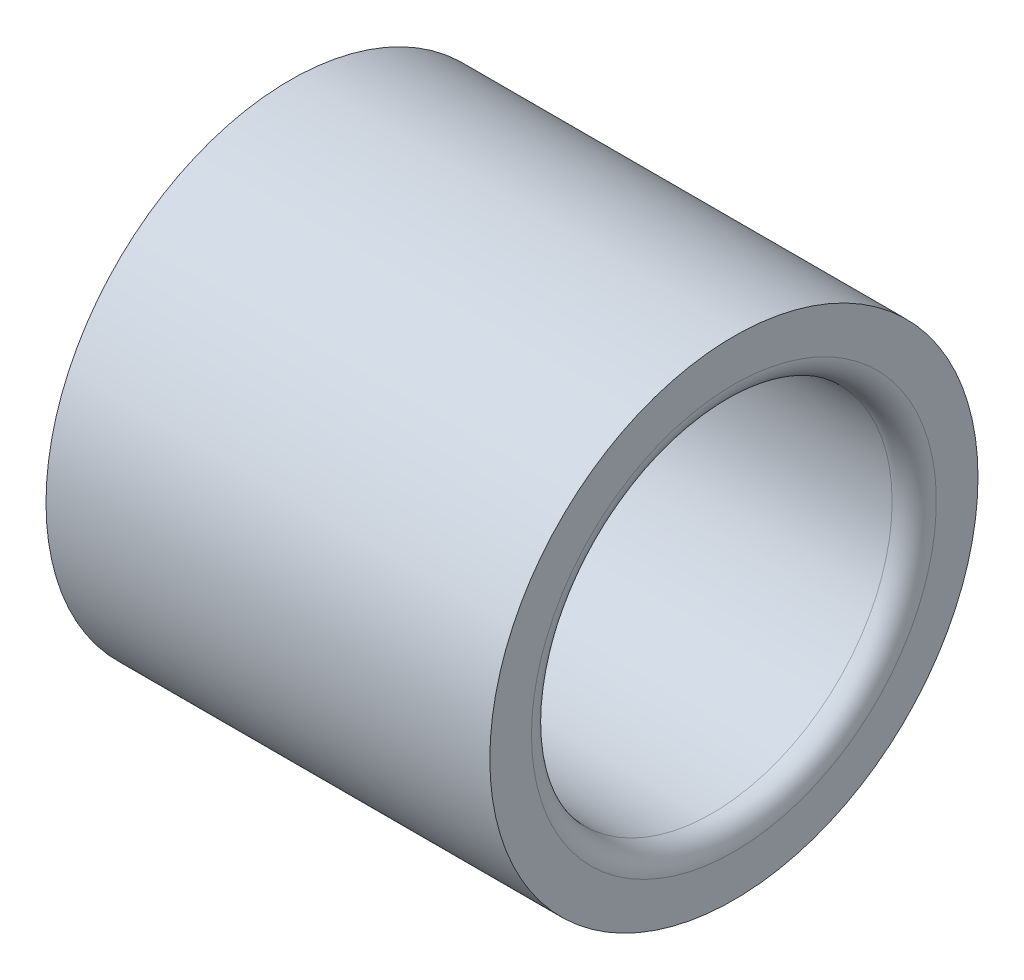
ISO-10303-21;
HEADER;
FILE_DESCRIPTION(('STEP AP214'),'2;1');
FILE_NAME('part.step','',(''),(''),'','','');
FILE_SCHEMA(('AUTOMOTIVE_DESIGN { 1 0 10303 214 1 1 1 1 }'));
ENDSEC;
DATA;
#1=APPLICATION_CONTEXT('core data for automotive mechanical design processes');
#2=APPLICATION_PROTOCOL_DEFINITION('international standard','automotive_design',2000,#1);
#3=PRODUCT_CONTEXT('',#1,'mechanical');
#4=PRODUCT('Part','Part','',(#3));
#5=PRODUCT_RELATED_PRODUCT_CATEGORY('part','',(#4));
#6=PRODUCT_DEFINITION_FORMATION('','',#4);
#7=PRODUCT_DEFINITION_CONTEXT('part definition',#1,'design');
#8=PRODUCT_DEFINITION('design','',#6,#7);
#9=PRODUCT_DEFINITION_SHAPE('','',#8);
#10=(LENGTH_UNIT() NAMED_UNIT(*) SI_UNIT(.MILLI.,.METRE.));
#11=(NAMED_UNIT(*) PLANE_ANGLE_UNIT() SI_UNIT($,.RADIAN.));
#12=(NAMED_UNIT(*) SI_UNIT($,.STERADIAN.) SOLID_ANGLE_UNIT());
#13=UNCERTAINTY_MEASURE_WITH_UNIT(LENGTH_MEASURE(1.E-05),#10,'distance_accuracy_value','');
#14=(GEOMETRIC_REPRESENTATION_CONTEXT(3) GLOBAL_UNCERTAINTY_ASSIGNED_CONTEXT((#13)) GLOBAL_UNIT_ASSIGNED_CONTEXT((#10,
#11,#12)) REPRESENTATION_CONTEXT('',''));
#15=CARTESIAN_POINT('',(0.,0.,0.));
#16=DIRECTION('',(0.,0.,1.));
#17=DIRECTION('',(1.,0.,0.));
#18=AXIS2_PLACEMENT_3D('',#15,#16,#17);
#19=CARTESIAN_POINT('',(0.,7.,0.));
#20=DIRECTION('',(1.,0.,0.));
#21=DIRECTION('',(0.,0.,-1.));
#22=AXIS2_PLACEMENT_3D('',#19,#20,#21);
#23=PLANE('',#22);
#24=CARTESIAN_POINT('',(0.,-4.,0.));
#25=DIRECTION('',(-1.,0.,0.));
#26=DIRECTION('',(0.,0.,1.));
#27=AXIS2_PLACEMENT_3D('',#24,#25,#26);
#28=CIRCLE('',#27,4.);
#29=CARTESIAN_POINT('',(0.,-4.,4.));
#30=VERTEX_POINT('',#29);
#31=EDGE_CURVE('E42',#30,#30,#28,.T.);
#32=ORIENTED_EDGE('',*,*,#31,.F.);
#33=EDGE_LOOP('',(#32));
#34=FACE_BOUND('',#33,.T.);
#35=CARTESIAN_POINT('',(0.,-4.,0.));
#36=DIRECTION('',(-1.,0.,0.));
#37=DIRECTION('',(0.,0.,1.));
#38=AXIS2_PLACEMENT_3D('',#35,#36,#37);
#39=CIRCLE('',#38,11.);
#40=CARTESIAN_POINT('',(0.,-4.,11.));
#41=VERTEX_POINT('',#40);
#42=EDGE_CURVE('E57',#41,#41,#39,.T.);
#43=ORIENTED_EDGE('',*,*,#42,.T.);
#44=EDGE_LOOP('',(#43));
#45=FACE_BOUND('',#44,.T.);
#46=ADVANCED_FACE('F31',(#34,#45),#23,.F.);
#47=CARTESIAN_POINT('',(-15.2207792207792,-4.,0.));
#48=DIRECTION('',(-1.,0.,0.));
#49=DIRECTION('',(0.,0.,1.));
#50=AXIS2_PLACEMENT_3D('',#47,#48,#49);
#51=CYLINDRICAL_SURFACE('',#50,4.);
#52=CARTESIAN_POINT('',(5.,-4.,0.));
#53=DIRECTION('',(-1.,0.,0.));
#54=DIRECTION('',(0.,0.,1.));
#55=AXIS2_PLACEMENT_3D('',#52,#53,#54);
#56=CIRCLE('',#55,4.);
#57=CARTESIAN_POINT('',(5.,-4.,4.));
#58=VERTEX_POINT('',#57);
#59=EDGE_CURVE('E46',#58,#58,#56,.T.);
#60=ORIENTED_EDGE('',*,*,#59,.F.);
#61=EDGE_LOOP('',(#60));
#62=FACE_BOUND('',#61,.T.);
#63=ORIENTED_EDGE('',*,*,#31,.T.);
#64=EDGE_LOOP('',(#63));
#65=FACE_BOUND('',#64,.T.);
#66=ADVANCED_FACE('F78',(#62,#65),#51,.F.);
#67=CARTESIAN_POINT('',(5.,0.,0.));
#68=DIRECTION('',(-1.,0.,0.));
#69=DIRECTION('',(0.,0.,1.));
#70=AXIS2_PLACEMENT_3D('',#67,#68,#69);
#71=PLANE('',#70);
#72=CARTESIAN_POINT('',(5.,-4.,0.));
#73=DIRECTION('',(-1.,0.,0.));
#74=DIRECTION('',(0.,0.,1.));
#75=AXIS2_PLACEMENT_3D('',#72,#73,#74);
#76=CIRCLE('',#75,8.);
#77=CARTESIAN_POINT('',(5.,-4.,8.));
#78=VERTEX_POINT('',#77);
#79=EDGE_CURVE('E51',#78,#78,#76,.T.);
#80=ORIENTED_EDGE('',*,*,#79,.F.);
#81=EDGE_LOOP('',(#80));
#82=FACE_BOUND('',#81,.T.);
#83=ORIENTED_EDGE('',*,*,#59,.T.);
#84=EDGE_LOOP('',(#83));
#85=FACE_BOUND('',#84,.T.);
#86=ADVANCED_FACE('F75',(#82,#85),#71,.F.);
#87=CARTESIAN_POINT('',(5.,-4.,0.));
#88=DIRECTION('',(1.,0.,0.));
#89=DIRECTION('',(0.,0.,1.));
#90=AXIS2_PLACEMENT_3D('',#87,#88,#89);
#91=CONICAL_SURFACE('',#90,8.,0.00872664625997167);
#92=CARTESIAN_POINT('',(19.0087265354983,-4.,0.));
#93=DIRECTION('',(-1.,0.,0.));
#94=DIRECTION('',(0.,0.,1.));
#95=AXIS2_PLACEMENT_3D('',#92,#93,#94);
#96=CIRCLE('',#95,8.12225230439219);
#97=CARTESIAN_POINT('',(19.0087265354983,-4.,8.12225230439219));
#98=VERTEX_POINT('',#97);
#99=EDGE_CURVE('E10',#98,#98,#96,.F.);
#100=ORIENTED_EDGE('',*,*,#99,.T.);
#101=EDGE_LOOP('',(#100));
#102=FACE_BOUND('',#101,.T.);
#103=ORIENTED_EDGE('',*,*,#79,.T.);
#104=EDGE_LOOP('',(#103));
#105=FACE_BOUND('',#104,.T.);
#106=ADVANCED_FACE('F70',(#102,#105),#91,.F.);
#107=CARTESIAN_POINT('',(20.,4.,0.));
#108=DIRECTION('',(-1.,0.,0.));
#109=DIRECTION('',(0.,0.,1.));
#110=AXIS2_PLACEMENT_3D('',#107,#108,#109);
#111=PLANE('',#110);
#112=CARTESIAN_POINT('',(20.,-4.,0.));
#113=DIRECTION('',(-1.,0.,0.));
#114=DIRECTION('',(0.,0.,1.));
#115=AXIS2_PLACEMENT_3D('',#112,#113,#114);
#116=CIRCLE('',#115,9.12221422745636);
#117=CARTESIAN_POINT('',(20.,-4.,9.12221422745636));
#118=VERTEX_POINT('',#117);
#119=EDGE_CURVE('E38',#118,#118,#116,.T.);
#120=ORIENTED_EDGE('',*,*,#119,.T.);
#121=EDGE_LOOP('',(#120));
#122=FACE_BOUND('',#121,.T.);
#123=CARTESIAN_POINT('',(20.,-4.,0.));
#124=DIRECTION('',(-1.,0.,0.));
#125=DIRECTION('',(0.,0.,1.));
#126=AXIS2_PLACEMENT_3D('',#123,#124,#125);
#127=CIRCLE('',#126,11.);
#128=CARTESIAN_POINT('',(20.,-4.,11.));
#129=VERTEX_POINT('',#128);
#130=EDGE_CURVE('E54',#129,#129,#127,.T.);
#131=ORIENTED_EDGE('',*,*,#130,.F.);
#132=EDGE_LOOP('',(#131));
#133=FACE_BOUND('',#132,.T.);
#134=ADVANCED_FACE('F65',(#122,#133),#111,.F.);
#135=CARTESIAN_POINT('',(-15.2207792207792,-4.,0.));
#136=DIRECTION('',(-1.,0.,0.));
#137=DIRECTION('',(0.,0.,1.));
#138=AXIS2_PLACEMENT_3D('',#135,#136,#137);
#139=CYLINDRICAL_SURFACE('',#138,11.);
#140=ORIENTED_EDGE('',*,*,#42,.F.);
#141=EDGE_LOOP('',(#140));
#142=FACE_BOUND('',#141,.T.);
#143=ORIENTED_EDGE('',*,*,#130,.T.);
#144=EDGE_LOOP('',(#143));
#145=FACE_BOUND('',#144,.T.);
#146=ADVANCED_FACE('F62',(#142,#145),#139,.T.);
#147=CARTESIAN_POINT('',(19.,-4.,0.));
#148=DIRECTION('',(-1.,0.,0.));
#149=DIRECTION('',(0.,0.,1.));
#150=AXIS2_PLACEMENT_3D('',#147,#148,#149);
#151=TOROIDAL_SURFACE('',#150,9.12221422745636,1.);
#152=ORIENTED_EDGE('',*,*,#99,.F.);
#153=EDGE_LOOP('',(#152));
#154=FACE_BOUND('',#153,.T.);
#155=ORIENTED_EDGE('',*,*,#119,.F.);
#156=EDGE_LOOP('',(#155));
#157=FACE_BOUND('',#156,.T.);
#158=ADVANCED_FACE('F33',(#154,#157),#151,.T.);
#159=CLOSED_SHELL('',(#46,#66,#86,#106,#134,#146,#158));
#160=MANIFOLD_SOLID_BREP('B2',#159);
#161=ADVANCED_BREP_SHAPE_REPRESENTATION('',(#18,#160),#14);
#162=SHAPE_DEFINITION_REPRESENTATION(#9,#161);
ENDSEC;
END-ISO-10303-21;
